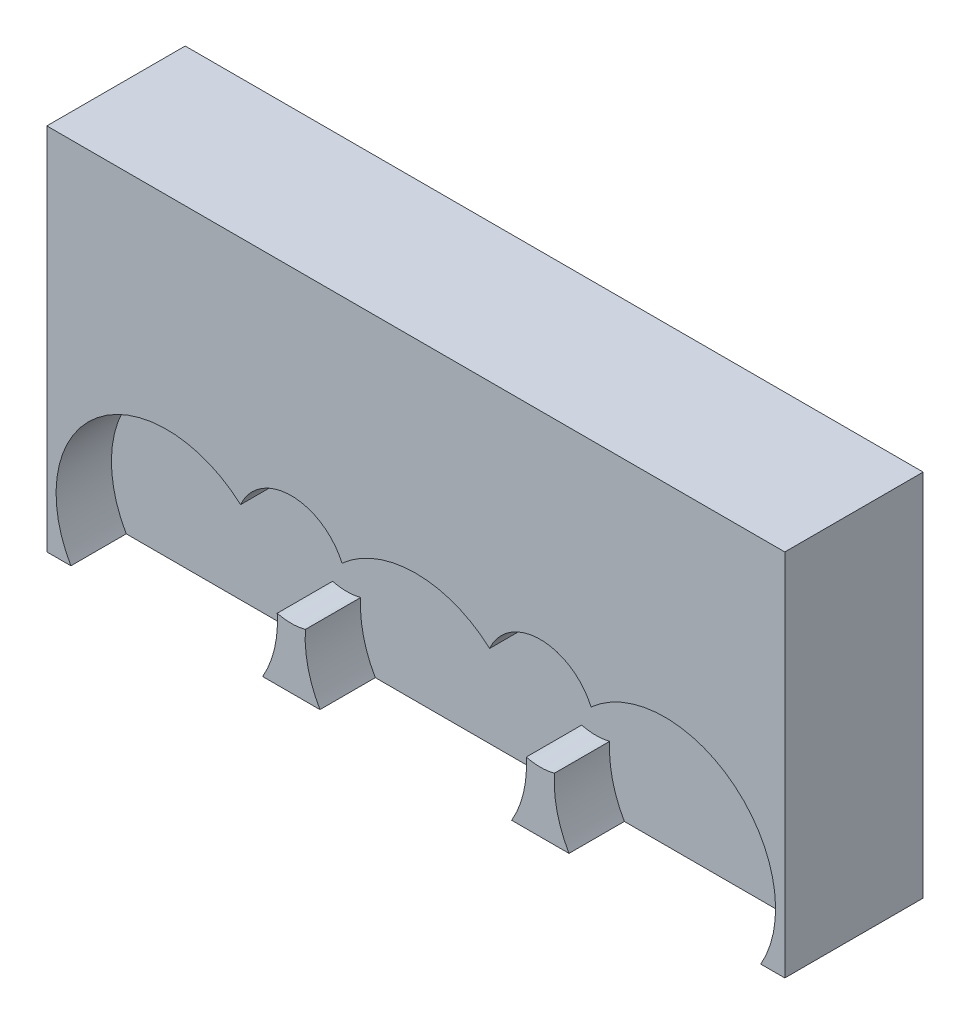
ISO-10303-21;
HEADER;
FILE_DESCRIPTION(('STEP AP214'),'2;1');
FILE_NAME('part.step','',(''),(''),'','','');
FILE_SCHEMA(('AUTOMOTIVE_DESIGN { 1 0 10303 214 1 1 1 1 }'));
ENDSEC;
DATA;
#1=APPLICATION_CONTEXT('core data for automotive mechanical design processes');
#2=APPLICATION_PROTOCOL_DEFINITION('international standard','automotive_design',2000,#1);
#3=PRODUCT_CONTEXT('',#1,'mechanical');
#4=PRODUCT('Part','Part','',(#3));
#5=PRODUCT_RELATED_PRODUCT_CATEGORY('part','',(#4));
#6=PRODUCT_DEFINITION_FORMATION('','',#4);
#7=PRODUCT_DEFINITION_CONTEXT('part definition',#1,'design');
#8=PRODUCT_DEFINITION('design','',#6,#7);
#9=PRODUCT_DEFINITION_SHAPE('','',#8);
#10=(LENGTH_UNIT() NAMED_UNIT(*) SI_UNIT(.MILLI.,.METRE.));
#11=(NAMED_UNIT(*) PLANE_ANGLE_UNIT() SI_UNIT($,.RADIAN.));
#12=(NAMED_UNIT(*) SI_UNIT($,.STERADIAN.) SOLID_ANGLE_UNIT());
#13=UNCERTAINTY_MEASURE_WITH_UNIT(LENGTH_MEASURE(1.E-05),#10,'distance_accuracy_value','');
#14=(GEOMETRIC_REPRESENTATION_CONTEXT(3) GLOBAL_UNCERTAINTY_ASSIGNED_CONTEXT((#13)) GLOBAL_UNIT_ASSIGNED_CONTEXT((#10,
#11,#12)) REPRESENTATION_CONTEXT('',''));
#15=CARTESIAN_POINT('',(0.,0.,0.));
#16=DIRECTION('',(0.,0.,1.));
#17=DIRECTION('',(1.,0.,0.));
#18=AXIS2_PLACEMENT_3D('',#15,#16,#17);
#19=CARTESIAN_POINT('',(0.,0.,15.));
#20=DIRECTION('',(0.,0.,-1.));
#21=DIRECTION('',(-1.,0.,0.));
#22=AXIS2_PLACEMENT_3D('',#19,#20,#21);
#23=PLANE('',#22);
#24=DIRECTION('',(1.,0.,0.));
#25=VECTOR('',#24,1.);
#26=CARTESIAN_POINT('',(-40.,-20.,15.));
#27=LINE('',#26,#25);
#28=CARTESIAN_POINT('',(10.3923048454133,-20.,15.));
#29=VERTEX_POINT('',#28);
#30=CARTESIAN_POINT('',(16.6076951545867,-20.,15.));
#31=VERTEX_POINT('',#30);
#32=EDGE_CURVE('E342',#29,#31,#27,.T.);
#33=ORIENTED_EDGE('',*,*,#32,.T.);
#34=CARTESIAN_POINT('',(27.,-14.,15.));
#35=DIRECTION('',(0.,0.,1.));
#36=DIRECTION('',(1.,0.,0.));
#37=AXIS2_PLACEMENT_3D('',#34,#35,#36);
#38=CIRCLE('',#37,12.);
#39=CARTESIAN_POINT('',(15.0225141509938,-13.2652668941339,15.));
#40=VERTEX_POINT('',#39);
#41=EDGE_CURVE('E239',#40,#31,#38,.T.);
#42=ORIENTED_EDGE('',*,*,#41,.F.);
#43=CARTESIAN_POINT('',(13.5,-7.46165158468899,15.));
#44=DIRECTION('',(0.,0.,1.));
#45=DIRECTION('',(1.,0.,0.));
#46=AXIS2_PLACEMENT_3D('',#43,#44,#45);
#47=CIRCLE('',#46,6.);
#48=CARTESIAN_POINT('',(11.9774858490062,-13.2652668941339,15.));
#49=VERTEX_POINT('',#48);
#50=EDGE_CURVE('E242',#40,#49,#47,.F.);
#51=ORIENTED_EDGE('',*,*,#50,.T.);
#52=CARTESIAN_POINT('',(0.,-14.,15.));
#53=DIRECTION('',(0.,0.,1.));
#54=DIRECTION('',(1.,0.,0.));
#55=AXIS2_PLACEMENT_3D('',#52,#53,#54);
#56=CIRCLE('',#55,12.);
#57=EDGE_CURVE('E273',#29,#49,#56,.T.);
#58=ORIENTED_EDGE('',*,*,#57,.F.);
#59=EDGE_LOOP('',(#33,#42,#51,#58));
#60=FACE_BOUND('',#59,.T.);
#61=ADVANCED_FACE('F78',(#60),#23,.F.);
#62=CARTESIAN_POINT('',(-16.6076951545867,-20.,15.));
#63=VERTEX_POINT('',#62);
#64=CARTESIAN_POINT('',(-10.3923048454133,-20.,15.));
#65=VERTEX_POINT('',#64);
#66=EDGE_CURVE('E318',#63,#65,#27,.T.);
#67=ORIENTED_EDGE('',*,*,#66,.T.);
#68=CARTESIAN_POINT('',(-11.9774858490062,-13.2652668941339,15.));
#69=VERTEX_POINT('',#68);
#70=EDGE_CURVE('E274',#69,#65,#56,.T.);
#71=ORIENTED_EDGE('',*,*,#70,.F.);
#72=CARTESIAN_POINT('',(-13.5,-7.46165158468899,15.));
#73=DIRECTION('',(0.,0.,1.));
#74=DIRECTION('',(1.,0.,0.));
#75=AXIS2_PLACEMENT_3D('',#72,#73,#74);
#76=CIRCLE('',#75,6.);
#77=CARTESIAN_POINT('',(-15.0225141509938,-13.2652668941339,15.));
#78=VERTEX_POINT('',#77);
#79=EDGE_CURVE('E277',#78,#69,#76,.T.);
#80=ORIENTED_EDGE('',*,*,#79,.F.);
#81=CARTESIAN_POINT('',(-27.,-14.,15.));
#82=DIRECTION('',(0.,0.,1.));
#83=DIRECTION('',(1.,0.,0.));
#84=AXIS2_PLACEMENT_3D('',#81,#82,#83);
#85=CIRCLE('',#84,12.);
#86=EDGE_CURVE('E279',#63,#78,#85,.T.);
#87=ORIENTED_EDGE('',*,*,#86,.F.);
#88=EDGE_LOOP('',(#67,#71,#80,#87));
#89=FACE_BOUND('',#88,.T.);
#90=ADVANCED_FACE('F352',(#89),#23,.F.);
#91=CARTESIAN_POINT('',(40.,-20.,15.));
#92=DIRECTION('',(-1.,0.,0.));
#93=DIRECTION('',(0.,0.,1.));
#94=AXIS2_PLACEMENT_3D('',#91,#92,#93);
#95=PLANE('',#94);
#96=DIRECTION('',(0.,1.,0.));
#97=VECTOR('',#96,1.);
#98=CARTESIAN_POINT('',(40.,-20.,0.));
#99=LINE('',#98,#97);
#100=CARTESIAN_POINT('',(40.,-20.,0.));
#101=VERTEX_POINT('',#100);
#102=CARTESIAN_POINT('',(40.,20.,0.));
#103=VERTEX_POINT('',#102);
#104=EDGE_CURVE('E282',#101,#103,#99,.T.);
#105=ORIENTED_EDGE('',*,*,#104,.T.);
#106=DIRECTION('',(0.,0.,-1.));
#107=VECTOR('',#106,1.);
#108=CARTESIAN_POINT('',(40.,20.,15.));
#109=LINE('',#108,#107);
#110=CARTESIAN_POINT('',(40.,20.,15.));
#111=VERTEX_POINT('',#110);
#112=EDGE_CURVE('E12',#111,#103,#109,.T.);
#113=ORIENTED_EDGE('',*,*,#112,.F.);
#114=DIRECTION('',(0.,1.,0.));
#115=VECTOR('',#114,1.);
#116=CARTESIAN_POINT('',(40.,-20.,15.));
#117=LINE('',#116,#115);
#118=CARTESIAN_POINT('',(40.,-20.,15.));
#119=VERTEX_POINT('',#118);
#120=EDGE_CURVE('E309',#119,#111,#117,.T.);
#121=ORIENTED_EDGE('',*,*,#120,.F.);
#122=DIRECTION('',(0.,0.,-1.));
#123=VECTOR('',#122,1.);
#124=CARTESIAN_POINT('',(40.,-20.,15.));
#125=LINE('',#124,#123);
#126=EDGE_CURVE('E317',#119,#101,#125,.T.);
#127=ORIENTED_EDGE('',*,*,#126,.T.);
#128=EDGE_LOOP('',(#105,#113,#121,#127));
#129=FACE_BOUND('',#128,.T.);
#130=ADVANCED_FACE('F80',(#129),#95,.F.);
#131=CARTESIAN_POINT('',(-40.,20.,15.));
#132=DIRECTION('',(0.,-1.,0.));
#133=DIRECTION('',(0.,0.,-1.));
#134=AXIS2_PLACEMENT_3D('',#131,#132,#133);
#135=PLANE('',#134);
#136=DIRECTION('',(-1.,0.,0.));
#137=VECTOR('',#136,1.);
#138=CARTESIAN_POINT('',(-40.,20.,0.));
#139=LINE('',#138,#137);
#140=CARTESIAN_POINT('',(-40.,20.,0.));
#141=VERTEX_POINT('',#140);
#142=EDGE_CURVE('E321',#103,#141,#139,.T.);
#143=ORIENTED_EDGE('',*,*,#142,.T.);
#144=DIRECTION('',(0.,0.,-1.));
#145=VECTOR('',#144,1.);
#146=CARTESIAN_POINT('',(-40.,20.,15.));
#147=LINE('',#146,#145);
#148=CARTESIAN_POINT('',(-40.,20.,15.));
#149=VERTEX_POINT('',#148);
#150=EDGE_CURVE('E86',#149,#141,#147,.T.);
#151=ORIENTED_EDGE('',*,*,#150,.F.);
#152=DIRECTION('',(-1.,0.,0.));
#153=VECTOR('',#152,1.);
#154=CARTESIAN_POINT('',(-40.,20.,15.));
#155=LINE('',#154,#153);
#156=EDGE_CURVE('E131',#111,#149,#155,.T.);
#157=ORIENTED_EDGE('',*,*,#156,.F.);
#158=ORIENTED_EDGE('',*,*,#112,.T.);
#159=EDGE_LOOP('',(#143,#151,#157,#158));
#160=FACE_BOUND('',#159,.T.);
#161=ADVANCED_FACE('F531',(#160),#135,.F.);
#162=CARTESIAN_POINT('',(-40.,-20.,15.));
#163=DIRECTION('',(1.,0.,0.));
#164=DIRECTION('',(0.,0.,-1.));
#165=AXIS2_PLACEMENT_3D('',#162,#163,#164);
#166=PLANE('',#165);
#167=DIRECTION('',(0.,-1.,0.));
#168=VECTOR('',#167,1.);
#169=CARTESIAN_POINT('',(-40.,-20.,0.));
#170=LINE('',#169,#168);
#171=CARTESIAN_POINT('',(-40.,-20.,0.));
#172=VERTEX_POINT('',#171);
#173=EDGE_CURVE('E323',#141,#172,#170,.T.);
#174=ORIENTED_EDGE('',*,*,#173,.T.);
#175=DIRECTION('',(0.,0.,-1.));
#176=VECTOR('',#175,1.);
#177=CARTESIAN_POINT('',(-40.,-20.,15.));
#178=LINE('',#177,#176);
#179=CARTESIAN_POINT('',(-40.,-20.,15.));
#180=VERTEX_POINT('',#179);
#181=EDGE_CURVE('E327',#180,#172,#178,.T.);
#182=ORIENTED_EDGE('',*,*,#181,.F.);
#183=DIRECTION('',(0.,-1.,0.));
#184=VECTOR('',#183,1.);
#185=CARTESIAN_POINT('',(-40.,-20.,15.));
#186=LINE('',#185,#184);
#187=EDGE_CURVE('E312',#149,#180,#186,.T.);
#188=ORIENTED_EDGE('',*,*,#187,.F.);
#189=ORIENTED_EDGE('',*,*,#150,.T.);
#190=EDGE_LOOP('',(#174,#182,#188,#189));
#191=FACE_BOUND('',#190,.T.);
#192=ADVANCED_FACE('F332',(#191),#166,.F.);
#193=CARTESIAN_POINT('',(-40.,-20.,15.));
#194=DIRECTION('',(0.,1.,0.));
#195=DIRECTION('',(0.,0.,1.));
#196=AXIS2_PLACEMENT_3D('',#193,#194,#195);
#197=PLANE('',#196);
#198=ORIENTED_EDGE('',*,*,#32,.F.);
#199=DIRECTION('',(0.,0.,1.));
#200=VECTOR('',#199,1.);
#201=CARTESIAN_POINT('',(10.3923048454133,-20.,9.));
#202=LINE('',#201,#200);
#203=CARTESIAN_POINT('',(10.3923048454133,-20.,9.));
#204=VERTEX_POINT('',#203);
#205=EDGE_CURVE('E290',#204,#29,#202,.T.);
#206=ORIENTED_EDGE('',*,*,#205,.F.);
#207=DIRECTION('',(1.,0.,0.));
#208=VECTOR('',#207,1.);
#209=CARTESIAN_POINT('',(0.,-20.,9.));
#210=LINE('',#209,#208);
#211=CARTESIAN_POINT('',(-10.3923048454133,-20.,9.));
#212=VERTEX_POINT('',#211);
#213=EDGE_CURVE('E251',#212,#204,#210,.T.);
#214=ORIENTED_EDGE('',*,*,#213,.F.);
#215=DIRECTION('',(0.,0.,1.));
#216=VECTOR('',#215,1.);
#217=CARTESIAN_POINT('',(-10.3923048454133,-20.,9.));
#218=LINE('',#217,#216);
#219=EDGE_CURVE('E292',#212,#65,#218,.T.);
#220=ORIENTED_EDGE('',*,*,#219,.T.);
#221=ORIENTED_EDGE('',*,*,#66,.F.);
#222=DIRECTION('',(0.,0.,1.));
#223=VECTOR('',#222,1.);
#224=CARTESIAN_POINT('',(-16.6076951545867,-20.,9.));
#225=LINE('',#224,#223);
#226=CARTESIAN_POINT('',(-16.6076951545867,-20.,9.));
#227=VERTEX_POINT('',#226);
#228=EDGE_CURVE('E299',#227,#63,#225,.T.);
#229=ORIENTED_EDGE('',*,*,#228,.F.);
#230=DIRECTION('',(1.,0.,0.));
#231=VECTOR('',#230,1.);
#232=CARTESIAN_POINT('',(0.,-20.,9.));
#233=LINE('',#232,#231);
#234=CARTESIAN_POINT('',(-37.3923048454133,-20.,9.));
#235=VERTEX_POINT('',#234);
#236=EDGE_CURVE('E262',#235,#227,#233,.T.);
#237=ORIENTED_EDGE('',*,*,#236,.F.);
#238=DIRECTION('',(0.,0.,1.));
#239=VECTOR('',#238,1.);
#240=CARTESIAN_POINT('',(-37.3923048454133,-20.,9.));
#241=LINE('',#240,#239);
#242=CARTESIAN_POINT('',(-37.3923048454133,-20.,15.));
#243=VERTEX_POINT('',#242);
#244=EDGE_CURVE('E301',#235,#243,#241,.T.);
#245=ORIENTED_EDGE('',*,*,#244,.T.);
#246=EDGE_CURVE('E314',#180,#243,#27,.T.);
#247=ORIENTED_EDGE('',*,*,#246,.F.);
#248=ORIENTED_EDGE('',*,*,#181,.T.);
#249=DIRECTION('',(1.,0.,0.));
#250=VECTOR('',#249,1.);
#251=CARTESIAN_POINT('',(-40.,-20.,0.));
#252=LINE('',#251,#250);
#253=EDGE_CURVE('E124',#172,#101,#252,.T.);
#254=ORIENTED_EDGE('',*,*,#253,.T.);
#255=ORIENTED_EDGE('',*,*,#126,.F.);
#256=CARTESIAN_POINT('',(37.3923048454133,-20.,15.));
#257=VERTEX_POINT('',#256);
#258=EDGE_CURVE('E102',#257,#119,#27,.T.);
#259=ORIENTED_EDGE('',*,*,#258,.F.);
#260=DIRECTION('',(0.,0.,1.));
#261=VECTOR('',#260,1.);
#262=CARTESIAN_POINT('',(37.3923048454133,-20.,9.));
#263=LINE('',#262,#261);
#264=CARTESIAN_POINT('',(37.3923048454133,-20.,9.));
#265=VERTEX_POINT('',#264);
#266=EDGE_CURVE('E280',#265,#257,#263,.T.);
#267=ORIENTED_EDGE('',*,*,#266,.F.);
#268=DIRECTION('',(1.,0.,0.));
#269=VECTOR('',#268,1.);
#270=CARTESIAN_POINT('',(0.,-20.,9.));
#271=LINE('',#270,#269);
#272=CARTESIAN_POINT('',(16.6076951545867,-20.,9.));
#273=VERTEX_POINT('',#272);
#274=EDGE_CURVE('E232',#273,#265,#271,.T.);
#275=ORIENTED_EDGE('',*,*,#274,.F.);
#276=DIRECTION('',(0.,0.,1.));
#277=VECTOR('',#276,1.);
#278=CARTESIAN_POINT('',(16.6076951545867,-20.,9.));
#279=LINE('',#278,#277);
#280=EDGE_CURVE('E283',#273,#31,#279,.T.);
#281=ORIENTED_EDGE('',*,*,#280,.T.);
#282=EDGE_LOOP('',(#198,#206,#214,#220,#221,#229,#237,#245,#247,#248,#254,#255,#259,#267,#275,#281));
#283=FACE_BOUND('',#282,.T.);
#284=ADVANCED_FACE('F341',(#283),#197,.F.);
#285=CARTESIAN_POINT('',(8.00251415099378,-5.05797745120576,15.));
#286=VERTEX_POINT('',#285);
#287=CARTESIAN_POINT('',(18.9974858490062,-5.05797745120577,15.));
#288=VERTEX_POINT('',#287);
#289=EDGE_CURVE('E268',#286,#288,#47,.F.);
#290=ORIENTED_EDGE('',*,*,#289,.T.);
#291=EDGE_CURVE('E230',#257,#288,#38,.T.);
#292=ORIENTED_EDGE('',*,*,#291,.F.);
#293=ORIENTED_EDGE('',*,*,#258,.T.);
#294=ORIENTED_EDGE('',*,*,#120,.T.);
#295=ORIENTED_EDGE('',*,*,#156,.T.);
#296=ORIENTED_EDGE('',*,*,#187,.T.);
#297=ORIENTED_EDGE('',*,*,#246,.T.);
#298=CARTESIAN_POINT('',(-18.9974858490062,-5.05797745120577,15.));
#299=VERTEX_POINT('',#298);
#300=EDGE_CURVE('E276',#299,#243,#85,.T.);
#301=ORIENTED_EDGE('',*,*,#300,.F.);
#302=CARTESIAN_POINT('',(-8.00251415099377,-5.05797745120577,15.));
#303=VERTEX_POINT('',#302);
#304=EDGE_CURVE('E93',#303,#299,#76,.T.);
#305=ORIENTED_EDGE('',*,*,#304,.F.);
#306=EDGE_CURVE('E270',#286,#303,#56,.T.);
#307=ORIENTED_EDGE('',*,*,#306,.F.);
#308=EDGE_LOOP('',(#290,#292,#293,#294,#295,#296,#297,#301,#305,#307));
#309=FACE_BOUND('',#308,.T.);
#310=ADVANCED_FACE('F388',(#309),#23,.F.);
#311=CARTESIAN_POINT('',(0.,0.,0.));
#312=DIRECTION('',(0.,0.,-1.));
#313=DIRECTION('',(-1.,0.,0.));
#314=AXIS2_PLACEMENT_3D('',#311,#312,#313);
#315=PLANE('',#314);
#316=ORIENTED_EDGE('',*,*,#104,.F.);
#317=ORIENTED_EDGE('',*,*,#253,.F.);
#318=ORIENTED_EDGE('',*,*,#173,.F.);
#319=ORIENTED_EDGE('',*,*,#142,.F.);
#320=EDGE_LOOP('',(#316,#317,#318,#319));
#321=FACE_BOUND('',#320,.T.);
#322=ADVANCED_FACE('F336',(#321),#315,.T.);
#323=CARTESIAN_POINT('',(-13.5,-7.46165158468899,9.));
#324=DIRECTION('',(0.,0.,1.));
#325=DIRECTION('',(1.,0.,0.));
#326=AXIS2_PLACEMENT_3D('',#323,#324,#325);
#327=CYLINDRICAL_SURFACE('',#326,6.);
#328=ORIENTED_EDGE('',*,*,#79,.T.);
#329=DIRECTION('',(0.,0.,1.));
#330=VECTOR('',#329,1.);
#331=CARTESIAN_POINT('',(-11.9774858490062,-13.2652668941339,9.));
#332=LINE('',#331,#330);
#333=CARTESIAN_POINT('',(-11.9774858490062,-13.2652668941339,9.));
#334=VERTEX_POINT('',#333);
#335=EDGE_CURVE('E295',#334,#69,#332,.T.);
#336=ORIENTED_EDGE('',*,*,#335,.F.);
#337=CARTESIAN_POINT('',(-13.5,-7.46165158468899,9.));
#338=DIRECTION('',(0.,0.,1.));
#339=DIRECTION('',(1.,0.,0.));
#340=AXIS2_PLACEMENT_3D('',#337,#338,#339);
#341=CIRCLE('',#340,6.);
#342=CARTESIAN_POINT('',(-15.0225141509938,-13.2652668941339,9.));
#343=VERTEX_POINT('',#342);
#344=EDGE_CURVE('E259',#343,#334,#341,.T.);
#345=ORIENTED_EDGE('',*,*,#344,.F.);
#346=DIRECTION('',(0.,0.,1.));
#347=VECTOR('',#346,1.);
#348=CARTESIAN_POINT('',(-15.0225141509938,-13.2652668941339,9.));
#349=LINE('',#348,#347);
#350=EDGE_CURVE('E297',#343,#78,#349,.T.);
#351=ORIENTED_EDGE('',*,*,#350,.T.);
#352=EDGE_LOOP('',(#328,#336,#345,#351));
#353=FACE_BOUND('',#352,.T.);
#354=ADVANCED_FACE('F369',(#353),#327,.F.);
#355=ORIENTED_EDGE('',*,*,#304,.T.);
#356=DIRECTION('',(0.,0.,1.));
#357=VECTOR('',#356,1.);
#358=CARTESIAN_POINT('',(-18.9974858490062,-5.05797745120577,9.));
#359=LINE('',#358,#357);
#360=CARTESIAN_POINT('',(-18.9974858490062,-5.05797745120577,9.));
#361=VERTEX_POINT('',#360);
#362=EDGE_CURVE('E304',#361,#299,#359,.T.);
#363=ORIENTED_EDGE('',*,*,#362,.F.);
#364=CARTESIAN_POINT('',(-8.00251415099377,-5.05797745120577,9.));
#365=VERTEX_POINT('',#364);
#366=EDGE_CURVE('E255',#365,#361,#341,.T.);
#367=ORIENTED_EDGE('',*,*,#366,.F.);
#368=DIRECTION('',(0.,0.,1.));
#369=VECTOR('',#368,1.);
#370=CARTESIAN_POINT('',(-8.00251415099377,-5.05797745120577,9.));
#371=LINE('',#370,#369);
#372=EDGE_CURVE('E306',#365,#303,#371,.T.);
#373=ORIENTED_EDGE('',*,*,#372,.T.);
#374=EDGE_LOOP('',(#355,#363,#367,#373));
#375=FACE_BOUND('',#374,.T.);
#376=ADVANCED_FACE('F408',(#375),#327,.F.);
#377=CARTESIAN_POINT('',(0.,-14.,9.));
#378=DIRECTION('',(0.,0.,1.));
#379=DIRECTION('',(1.,0.,0.));
#380=AXIS2_PLACEMENT_3D('',#377,#378,#379);
#381=CYLINDRICAL_SURFACE('',#380,12.);
#382=ORIENTED_EDGE('',*,*,#306,.T.);
#383=ORIENTED_EDGE('',*,*,#372,.F.);
#384=CARTESIAN_POINT('',(0.,-14.,9.));
#385=DIRECTION('',(0.,0.,1.));
#386=DIRECTION('',(1.,0.,0.));
#387=AXIS2_PLACEMENT_3D('',#384,#385,#386);
#388=CIRCLE('',#387,12.);
#389=CARTESIAN_POINT('',(8.00251415099378,-5.05797745120576,9.));
#390=VERTEX_POINT('',#389);
#391=EDGE_CURVE('E223',#390,#365,#388,.T.);
#392=ORIENTED_EDGE('',*,*,#391,.F.);
#393=DIRECTION('',(0.,0.,1.));
#394=VECTOR('',#393,1.);
#395=CARTESIAN_POINT('',(8.00251415099378,-5.05797745120576,9.));
#396=LINE('',#395,#394);
#397=EDGE_CURVE('E218',#390,#286,#396,.T.);
#398=ORIENTED_EDGE('',*,*,#397,.T.);
#399=EDGE_LOOP('',(#382,#383,#392,#398));
#400=FACE_BOUND('',#399,.T.);
#401=ADVANCED_FACE('F401',(#400),#381,.F.);
#402=CARTESIAN_POINT('',(13.5,-7.46165158468899,9.));
#403=DIRECTION('',(0.,0.,1.));
#404=DIRECTION('',(1.,0.,0.));
#405=AXIS2_PLACEMENT_3D('',#402,#403,#404);
#406=CYLINDRICAL_SURFACE('',#405,6.);
#407=ORIENTED_EDGE('',*,*,#289,.F.);
#408=ORIENTED_EDGE('',*,*,#397,.F.);
#409=CARTESIAN_POINT('',(13.5,-7.46165158468899,9.));
#410=DIRECTION('',(0.,0.,1.));
#411=DIRECTION('',(1.,0.,0.));
#412=AXIS2_PLACEMENT_3D('',#409,#410,#411);
#413=CIRCLE('',#412,6.);
#414=CARTESIAN_POINT('',(18.9974858490062,-5.05797745120577,9.));
#415=VERTEX_POINT('',#414);
#416=EDGE_CURVE('E212',#390,#415,#413,.F.);
#417=ORIENTED_EDGE('',*,*,#416,.T.);
#418=DIRECTION('',(0.,0.,1.));
#419=VECTOR('',#418,1.);
#420=CARTESIAN_POINT('',(18.9974858490062,-5.05797745120577,9.));
#421=LINE('',#420,#419);
#422=EDGE_CURVE('E216',#415,#288,#421,.T.);
#423=ORIENTED_EDGE('',*,*,#422,.T.);
#424=EDGE_LOOP('',(#407,#408,#417,#423));
#425=FACE_BOUND('',#424,.T.);
#426=ADVANCED_FACE('F215',(#425),#406,.F.);
#427=CARTESIAN_POINT('',(27.,-14.,9.));
#428=DIRECTION('',(0.,0.,1.));
#429=DIRECTION('',(1.,0.,0.));
#430=AXIS2_PLACEMENT_3D('',#427,#428,#429);
#431=CYLINDRICAL_SURFACE('',#430,12.);
#432=ORIENTED_EDGE('',*,*,#291,.T.);
#433=ORIENTED_EDGE('',*,*,#422,.F.);
#434=CARTESIAN_POINT('',(27.,-14.,9.));
#435=DIRECTION('',(0.,0.,1.));
#436=DIRECTION('',(1.,0.,0.));
#437=AXIS2_PLACEMENT_3D('',#434,#435,#436);
#438=CIRCLE('',#437,12.);
#439=EDGE_CURVE('E224',#265,#415,#438,.T.);
#440=ORIENTED_EDGE('',*,*,#439,.F.);
#441=ORIENTED_EDGE('',*,*,#266,.T.);
#442=EDGE_LOOP('',(#432,#433,#440,#441));
#443=FACE_BOUND('',#442,.T.);
#444=ADVANCED_FACE('F228',(#443),#431,.F.);
#445=ORIENTED_EDGE('',*,*,#41,.T.);
#446=ORIENTED_EDGE('',*,*,#280,.F.);
#447=CARTESIAN_POINT('',(15.0225141509938,-13.2652668941339,9.));
#448=VERTEX_POINT('',#447);
#449=EDGE_CURVE('E241',#448,#273,#438,.T.);
#450=ORIENTED_EDGE('',*,*,#449,.F.);
#451=DIRECTION('',(0.,0.,1.));
#452=VECTOR('',#451,1.);
#453=CARTESIAN_POINT('',(15.0225141509938,-13.2652668941339,9.));
#454=LINE('',#453,#452);
#455=EDGE_CURVE('E286',#448,#40,#454,.T.);
#456=ORIENTED_EDGE('',*,*,#455,.T.);
#457=EDGE_LOOP('',(#445,#446,#450,#456));
#458=FACE_BOUND('',#457,.T.);
#459=ADVANCED_FACE('F377',(#458),#431,.F.);
#460=ORIENTED_EDGE('',*,*,#50,.F.);
#461=ORIENTED_EDGE('',*,*,#455,.F.);
#462=CARTESIAN_POINT('',(11.9774858490062,-13.2652668941339,9.));
#463=VERTEX_POINT('',#462);
#464=EDGE_CURVE('E226',#448,#463,#413,.F.);
#465=ORIENTED_EDGE('',*,*,#464,.T.);
#466=DIRECTION('',(0.,0.,1.));
#467=VECTOR('',#466,1.);
#468=CARTESIAN_POINT('',(11.9774858490062,-13.2652668941339,9.));
#469=LINE('',#468,#467);
#470=EDGE_CURVE('E288',#463,#49,#469,.T.);
#471=ORIENTED_EDGE('',*,*,#470,.T.);
#472=EDGE_LOOP('',(#460,#461,#465,#471));
#473=FACE_BOUND('',#472,.T.);
#474=ADVANCED_FACE('F374',(#473),#406,.F.);
#475=ORIENTED_EDGE('',*,*,#57,.T.);
#476=ORIENTED_EDGE('',*,*,#470,.F.);
#477=EDGE_CURVE('E247',#204,#463,#388,.T.);
#478=ORIENTED_EDGE('',*,*,#477,.F.);
#479=ORIENTED_EDGE('',*,*,#205,.T.);
#480=EDGE_LOOP('',(#475,#476,#478,#479));
#481=FACE_BOUND('',#480,.T.);
#482=ADVANCED_FACE('F375',(#481),#381,.F.);
#483=ORIENTED_EDGE('',*,*,#70,.T.);
#484=ORIENTED_EDGE('',*,*,#219,.F.);
#485=EDGE_CURVE('E253',#334,#212,#388,.T.);
#486=ORIENTED_EDGE('',*,*,#485,.F.);
#487=ORIENTED_EDGE('',*,*,#335,.T.);
#488=EDGE_LOOP('',(#483,#484,#486,#487));
#489=FACE_BOUND('',#488,.T.);
#490=ADVANCED_FACE('F361',(#489),#381,.F.);
#491=CARTESIAN_POINT('',(0.,0.,9.));
#492=DIRECTION('',(0.,0.,1.));
#493=DIRECTION('',(1.,0.,0.));
#494=AXIS2_PLACEMENT_3D('',#491,#492,#493);
#495=PLANE('',#494);
#496=ORIENTED_EDGE('',*,*,#485,.T.);
#497=ORIENTED_EDGE('',*,*,#213,.T.);
#498=ORIENTED_EDGE('',*,*,#477,.T.);
#499=ORIENTED_EDGE('',*,*,#464,.F.);
#500=ORIENTED_EDGE('',*,*,#449,.T.);
#501=ORIENTED_EDGE('',*,*,#274,.T.);
#502=ORIENTED_EDGE('',*,*,#439,.T.);
#503=ORIENTED_EDGE('',*,*,#416,.F.);
#504=ORIENTED_EDGE('',*,*,#391,.T.);
#505=ORIENTED_EDGE('',*,*,#366,.T.);
#506=CARTESIAN_POINT('',(-27.,-14.,9.));
#507=DIRECTION('',(0.,0.,1.));
#508=DIRECTION('',(1.,0.,0.));
#509=AXIS2_PLACEMENT_3D('',#506,#507,#508);
#510=CIRCLE('',#509,12.);
#511=EDGE_CURVE('E258',#361,#235,#510,.T.);
#512=ORIENTED_EDGE('',*,*,#511,.T.);
#513=ORIENTED_EDGE('',*,*,#236,.T.);
#514=EDGE_CURVE('E263',#227,#343,#510,.T.);
#515=ORIENTED_EDGE('',*,*,#514,.T.);
#516=ORIENTED_EDGE('',*,*,#344,.T.);
#517=EDGE_LOOP('',(#496,#497,#498,#499,#500,#501,#502,#503,#504,#505,#512,#513,#515,#516));
#518=FACE_BOUND('',#517,.T.);
#519=ADVANCED_FACE('F235',(#518),#495,.T.);
#520=CARTESIAN_POINT('',(-27.,-14.,9.));
#521=DIRECTION('',(0.,0.,1.));
#522=DIRECTION('',(1.,0.,0.));
#523=AXIS2_PLACEMENT_3D('',#520,#521,#522);
#524=CYLINDRICAL_SURFACE('',#523,12.);
#525=ORIENTED_EDGE('',*,*,#86,.T.);
#526=ORIENTED_EDGE('',*,*,#350,.F.);
#527=ORIENTED_EDGE('',*,*,#514,.F.);
#528=ORIENTED_EDGE('',*,*,#228,.T.);
#529=EDGE_LOOP('',(#525,#526,#527,#528));
#530=FACE_BOUND('',#529,.T.);
#531=ADVANCED_FACE('F366',(#530),#524,.F.);
#532=ORIENTED_EDGE('',*,*,#300,.T.);
#533=ORIENTED_EDGE('',*,*,#244,.F.);
#534=ORIENTED_EDGE('',*,*,#511,.F.);
#535=ORIENTED_EDGE('',*,*,#362,.T.);
#536=EDGE_LOOP('',(#532,#533,#534,#535));
#537=FACE_BOUND('',#536,.T.);
#538=ADVANCED_FACE('F410',(#537),#524,.F.);
#539=CLOSED_SHELL('',(#61,#90,#130,#161,#192,#284,#310,#322,#354,#376,#401,#426,#444,#459,#474,
#482,#490,#519,#531,#538));
#540=MANIFOLD_SOLID_BREP('B2',#539);
#541=ADVANCED_BREP_SHAPE_REPRESENTATION('',(#18,#540),#14);
#542=SHAPE_DEFINITION_REPRESENTATION(#9,#541);
ENDSEC;
END-ISO-10303-21;
